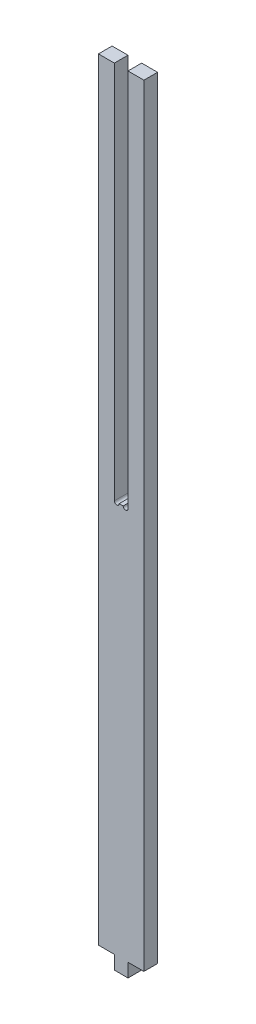
ISO-10303-21;
HEADER;
FILE_DESCRIPTION(('STEP AP214'),'2;1');
FILE_NAME('part.step','',(''),(''),'','','');
FILE_SCHEMA(('AUTOMOTIVE_DESIGN { 1 0 10303 214 1 1 1 1 }'));
ENDSEC;
DATA;
#1=APPLICATION_CONTEXT('core data for automotive mechanical design processes');
#2=APPLICATION_PROTOCOL_DEFINITION('international standard','automotive_design',2000,#1);
#3=PRODUCT_CONTEXT('',#1,'mechanical');
#4=PRODUCT('Part','Part','',(#3));
#5=PRODUCT_RELATED_PRODUCT_CATEGORY('part','',(#4));
#6=PRODUCT_DEFINITION_FORMATION('','',#4);
#7=PRODUCT_DEFINITION_CONTEXT('part definition',#1,'design');
#8=PRODUCT_DEFINITION('design','',#6,#7);
#9=PRODUCT_DEFINITION_SHAPE('','',#8);
#10=(LENGTH_UNIT() NAMED_UNIT(*) SI_UNIT(.MILLI.,.METRE.));
#11=(NAMED_UNIT(*) PLANE_ANGLE_UNIT() SI_UNIT($,.RADIAN.));
#12=(NAMED_UNIT(*) SI_UNIT($,.STERADIAN.) SOLID_ANGLE_UNIT());
#13=UNCERTAINTY_MEASURE_WITH_UNIT(LENGTH_MEASURE(1.E-05),#10,'distance_accuracy_value','');
#14=(GEOMETRIC_REPRESENTATION_CONTEXT(3) GLOBAL_UNCERTAINTY_ASSIGNED_CONTEXT((#13)) GLOBAL_UNIT_ASSIGNED_CONTEXT((#10,
#11,#12)) REPRESENTATION_CONTEXT('',''));
#15=CARTESIAN_POINT('',(0.,0.,0.));
#16=DIRECTION('',(0.,0.,1.));
#17=DIRECTION('',(1.,0.,0.));
#18=AXIS2_PLACEMENT_3D('',#15,#16,#17);
#19=CARTESIAN_POINT('',(-33.2222222222223,843.,18.));
#20=DIRECTION('',(0.,1.,0.));
#21=DIRECTION('',(0.,0.,1.));
#22=AXIS2_PLACEMENT_3D('',#19,#20,#21);
#23=PLANE('',#22);
#24=DIRECTION('',(1.,0.,0.));
#25=VECTOR('',#24,1.);
#26=CARTESIAN_POINT('',(-33.2222222222223,843.,0.));
#27=LINE('',#26,#25);
#28=CARTESIAN_POINT('',(-33.2222222222223,843.,0.));
#29=VERTEX_POINT('',#28);
#30=CARTESIAN_POINT('',(-12.2222222222223,843.,0.));
#31=VERTEX_POINT('',#30);
#32=EDGE_CURVE('E166',#29,#31,#27,.T.);
#33=ORIENTED_EDGE('',*,*,#32,.F.);
#34=DIRECTION('',(0.,0.,-1.));
#35=VECTOR('',#34,1.);
#36=CARTESIAN_POINT('',(-33.2222222222223,843.,18.));
#37=LINE('',#36,#35);
#38=CARTESIAN_POINT('',(-33.2222222222223,843.,18.));
#39=VERTEX_POINT('',#38);
#40=EDGE_CURVE('E11',#39,#29,#37,.T.);
#41=ORIENTED_EDGE('',*,*,#40,.F.);
#42=DIRECTION('',(1.,0.,0.));
#43=VECTOR('',#42,1.);
#44=CARTESIAN_POINT('',(-33.2222222222223,843.,18.));
#45=LINE('',#44,#43);
#46=CARTESIAN_POINT('',(-12.2222222222223,843.,18.));
#47=VERTEX_POINT('',#46);
#48=EDGE_CURVE('E201',#39,#47,#45,.T.);
#49=ORIENTED_EDGE('',*,*,#48,.T.);
#50=DIRECTION('',(0.,0.,-1.));
#51=VECTOR('',#50,1.);
#52=CARTESIAN_POINT('',(-12.2222222222223,843.,18.));
#53=LINE('',#52,#51);
#54=EDGE_CURVE('E36',#47,#31,#53,.T.);
#55=ORIENTED_EDGE('',*,*,#54,.T.);
#56=EDGE_LOOP('',(#33,#41,#49,#55));
#57=FACE_BOUND('',#56,.T.);
#58=ADVANCED_FACE('F33',(#57),#23,.T.);
#59=CARTESIAN_POINT('',(-33.2222222222223,343.,18.));
#60=DIRECTION('',(-1.,0.,0.));
#61=DIRECTION('',(0.,0.,1.));
#62=AXIS2_PLACEMENT_3D('',#59,#60,#61);
#63=PLANE('',#62);
#64=DIRECTION('',(0.,1.,0.));
#65=VECTOR('',#64,1.);
#66=CARTESIAN_POINT('',(-33.2222222222223,343.,0.));
#67=LINE('',#66,#65);
#68=CARTESIAN_POINT('',(-33.2222222222223,343.,0.));
#69=VERTEX_POINT('',#68);
#70=EDGE_CURVE('E199',#69,#29,#67,.T.);
#71=ORIENTED_EDGE('',*,*,#70,.F.);
#72=DIRECTION('',(0.,0.,-1.));
#73=VECTOR('',#72,1.);
#74=CARTESIAN_POINT('',(-33.2222222222223,343.,18.));
#75=LINE('',#74,#73);
#76=CARTESIAN_POINT('',(-33.2222222222223,343.,18.));
#77=VERTEX_POINT('',#76);
#78=EDGE_CURVE('E42',#77,#69,#75,.T.);
#79=ORIENTED_EDGE('',*,*,#78,.F.);
#80=DIRECTION('',(0.,1.,0.));
#81=VECTOR('',#80,1.);
#82=CARTESIAN_POINT('',(-33.2222222222223,343.,18.));
#83=LINE('',#82,#81);
#84=EDGE_CURVE('E148',#77,#39,#83,.T.);
#85=ORIENTED_EDGE('',*,*,#84,.T.);
#86=ORIENTED_EDGE('',*,*,#40,.T.);
#87=EDGE_LOOP('',(#71,#79,#85,#86));
#88=FACE_BOUND('',#87,.T.);
#89=ADVANCED_FACE('F229',(#88),#63,.T.);
#90=CARTESIAN_POINT('',(-36.3972222222223,343.,18.));
#91=DIRECTION('',(0.,0.,-1.));
#92=DIRECTION('',(-1.,0.,0.));
#93=AXIS2_PLACEMENT_3D('',#90,#91,#92);
#94=CYLINDRICAL_SURFACE('',#93,3.175);
#95=CARTESIAN_POINT('',(-36.3972222222223,343.,0.));
#96=DIRECTION('',(0.,0.,-1.));
#97=DIRECTION('',(-1.,0.,0.));
#98=AXIS2_PLACEMENT_3D('',#95,#96,#97);
#99=CIRCLE('',#98,3.175);
#100=CARTESIAN_POINT('',(-39.5722222222223,343.,0.));
#101=VERTEX_POINT('',#100);
#102=EDGE_CURVE('E152',#69,#101,#99,.T.);
#103=ORIENTED_EDGE('',*,*,#102,.T.);
#104=DIRECTION('',(0.,0.,-1.));
#105=VECTOR('',#104,1.);
#106=CARTESIAN_POINT('',(-39.5722222222223,343.,18.));
#107=LINE('',#106,#105);
#108=CARTESIAN_POINT('',(-39.5722222222223,343.,18.));
#109=VERTEX_POINT('',#108);
#110=EDGE_CURVE('E150',#109,#101,#107,.T.);
#111=ORIENTED_EDGE('',*,*,#110,.F.);
#112=CARTESIAN_POINT('',(-36.3972222222223,343.,18.));
#113=DIRECTION('',(0.,0.,-1.));
#114=DIRECTION('',(-1.,0.,0.));
#115=AXIS2_PLACEMENT_3D('',#112,#113,#114);
#116=CIRCLE('',#115,3.175);
#117=EDGE_CURVE('E141',#77,#109,#116,.T.);
#118=ORIENTED_EDGE('',*,*,#117,.F.);
#119=ORIENTED_EDGE('',*,*,#78,.T.);
#120=EDGE_LOOP('',(#103,#111,#118,#119));
#121=FACE_BOUND('',#120,.T.);
#122=ADVANCED_FACE('F151',(#121),#94,.F.);
#123=CARTESIAN_POINT('',(-44.8722222222223,343.,18.));
#124=DIRECTION('',(0.,1.,0.));
#125=DIRECTION('',(0.,0.,1.));
#126=AXIS2_PLACEMENT_3D('',#123,#124,#125);
#127=PLANE('',#126);
#128=DIRECTION('',(1.,0.,0.));
#129=VECTOR('',#128,1.);
#130=CARTESIAN_POINT('',(-44.8722222222223,343.,0.));
#131=LINE('',#130,#129);
#132=CARTESIAN_POINT('',(-44.8722222222223,343.,0.));
#133=VERTEX_POINT('',#132);
#134=EDGE_CURVE('E196',#133,#101,#131,.T.);
#135=ORIENTED_EDGE('',*,*,#134,.F.);
#136=DIRECTION('',(0.,0.,-1.));
#137=VECTOR('',#136,1.);
#138=CARTESIAN_POINT('',(-44.8722222222223,343.,18.));
#139=LINE('',#138,#137);
#140=CARTESIAN_POINT('',(-44.8722222222223,343.,18.));
#141=VERTEX_POINT('',#140);
#142=EDGE_CURVE('E156',#141,#133,#139,.T.);
#143=ORIENTED_EDGE('',*,*,#142,.F.);
#144=DIRECTION('',(1.,0.,0.));
#145=VECTOR('',#144,1.);
#146=CARTESIAN_POINT('',(-44.8722222222223,343.,18.));
#147=LINE('',#146,#145);
#148=EDGE_CURVE('E146',#141,#109,#147,.T.);
#149=ORIENTED_EDGE('',*,*,#148,.T.);
#150=ORIENTED_EDGE('',*,*,#110,.T.);
#151=EDGE_LOOP('',(#135,#143,#149,#150));
#152=FACE_BOUND('',#151,.T.);
#153=ADVANCED_FACE('F158',(#152),#127,.T.);
#154=CARTESIAN_POINT('',(-48.0472222222223,343.,18.));
#155=DIRECTION('',(0.,0.,-1.));
#156=DIRECTION('',(-1.,0.,0.));
#157=AXIS2_PLACEMENT_3D('',#154,#155,#156);
#158=CYLINDRICAL_SURFACE('',#157,3.175);
#159=CARTESIAN_POINT('',(-48.0472222222223,343.,0.));
#160=DIRECTION('',(0.,0.,1.));
#161=DIRECTION('',(1.,0.,0.));
#162=AXIS2_PLACEMENT_3D('',#159,#160,#161);
#163=CIRCLE('',#162,3.175);
#164=CARTESIAN_POINT('',(-51.2222222222223,343.,0.));
#165=VERTEX_POINT('',#164);
#166=EDGE_CURVE('E193',#165,#133,#163,.T.);
#167=ORIENTED_EDGE('',*,*,#166,.F.);
#168=DIRECTION('',(0.,0.,-1.));
#169=VECTOR('',#168,1.);
#170=CARTESIAN_POINT('',(-51.2222222222223,343.,18.));
#171=LINE('',#170,#169);
#172=CARTESIAN_POINT('',(-51.2222222222223,343.,18.));
#173=VERTEX_POINT('',#172);
#174=EDGE_CURVE('E205',#173,#165,#171,.T.);
#175=ORIENTED_EDGE('',*,*,#174,.F.);
#176=CARTESIAN_POINT('',(-48.0472222222223,343.,18.));
#177=DIRECTION('',(0.,0.,1.));
#178=DIRECTION('',(1.,0.,0.));
#179=AXIS2_PLACEMENT_3D('',#176,#177,#178);
#180=CIRCLE('',#179,3.175);
#181=EDGE_CURVE('E159',#173,#141,#180,.T.);
#182=ORIENTED_EDGE('',*,*,#181,.T.);
#183=ORIENTED_EDGE('',*,*,#142,.T.);
#184=EDGE_LOOP('',(#167,#175,#182,#183));
#185=FACE_BOUND('',#184,.T.);
#186=ADVANCED_FACE('F242',(#185),#158,.F.);
#187=CARTESIAN_POINT('',(-51.2222222222223,843.,18.));
#188=DIRECTION('',(1.,0.,0.));
#189=DIRECTION('',(0.,1.,0.));
#190=AXIS2_PLACEMENT_3D('',#187,#188,#189);
#191=PLANE('',#190);
#192=DIRECTION('',(0.,-1.,0.));
#193=VECTOR('',#192,1.);
#194=CARTESIAN_POINT('',(-51.2222222222223,843.,0.));
#195=LINE('',#194,#193);
#196=CARTESIAN_POINT('',(-51.2222222222223,843.,0.));
#197=VERTEX_POINT('',#196);
#198=EDGE_CURVE('E190',#197,#165,#195,.T.);
#199=ORIENTED_EDGE('',*,*,#198,.F.);
#200=DIRECTION('',(0.,0.,-1.));
#201=VECTOR('',#200,1.);
#202=CARTESIAN_POINT('',(-51.2222222222223,843.,18.));
#203=LINE('',#202,#201);
#204=CARTESIAN_POINT('',(-51.2222222222223,843.,18.));
#205=VERTEX_POINT('',#204);
#206=EDGE_CURVE('E207',#205,#197,#203,.T.);
#207=ORIENTED_EDGE('',*,*,#206,.F.);
#208=DIRECTION('',(0.,-1.,0.));
#209=VECTOR('',#208,1.);
#210=CARTESIAN_POINT('',(-51.2222222222223,843.,18.));
#211=LINE('',#210,#209);
#212=EDGE_CURVE('E161',#205,#173,#211,.T.);
#213=ORIENTED_EDGE('',*,*,#212,.T.);
#214=ORIENTED_EDGE('',*,*,#174,.T.);
#215=EDGE_LOOP('',(#199,#207,#213,#214));
#216=FACE_BOUND('',#215,.T.);
#217=ADVANCED_FACE('F245',(#216),#191,.T.);
#218=CARTESIAN_POINT('',(-72.2222222222223,843.,18.));
#219=DIRECTION('',(0.,1.,0.));
#220=DIRECTION('',(0.,0.,1.));
#221=AXIS2_PLACEMENT_3D('',#218,#219,#220);
#222=PLANE('',#221);
#223=DIRECTION('',(1.,0.,0.));
#224=VECTOR('',#223,1.);
#225=CARTESIAN_POINT('',(-72.2222222222223,843.,0.));
#226=LINE('',#225,#224);
#227=CARTESIAN_POINT('',(-72.2222222222223,843.,0.));
#228=VERTEX_POINT('',#227);
#229=EDGE_CURVE('E187',#228,#197,#226,.T.);
#230=ORIENTED_EDGE('',*,*,#229,.F.);
#231=DIRECTION('',(0.,0.,-1.));
#232=VECTOR('',#231,1.);
#233=CARTESIAN_POINT('',(-72.2222222222223,843.,18.));
#234=LINE('',#233,#232);
#235=CARTESIAN_POINT('',(-72.2222222222223,843.,18.));
#236=VERTEX_POINT('',#235);
#237=EDGE_CURVE('E209',#236,#228,#234,.T.);
#238=ORIENTED_EDGE('',*,*,#237,.F.);
#239=DIRECTION('',(1.,0.,0.));
#240=VECTOR('',#239,1.);
#241=CARTESIAN_POINT('',(-72.2222222222223,843.,18.));
#242=LINE('',#241,#240);
#243=EDGE_CURVE('E398',#236,#205,#242,.T.);
#244=ORIENTED_EDGE('',*,*,#243,.T.);
#245=ORIENTED_EDGE('',*,*,#206,.T.);
#246=EDGE_LOOP('',(#230,#238,#244,#245));
#247=FACE_BOUND('',#246,.T.);
#248=ADVANCED_FACE('F249',(#247),#222,.T.);
#249=CARTESIAN_POINT('',(-72.2222222222223,843.,18.));
#250=DIRECTION('',(1.,0.,0.));
#251=DIRECTION('',(0.,1.,0.));
#252=AXIS2_PLACEMENT_3D('',#249,#250,#251);
#253=PLANE('',#252);
#254=DIRECTION('',(0.,-1.,0.));
#255=VECTOR('',#254,1.);
#256=CARTESIAN_POINT('',(-72.2222222222223,843.,0.));
#257=LINE('',#256,#255);
#258=CARTESIAN_POINT('',(-72.2222222222222,-175.,0.));
#259=VERTEX_POINT('',#258);
#260=EDGE_CURVE('E185',#228,#259,#257,.T.);
#261=ORIENTED_EDGE('',*,*,#260,.T.);
#262=DIRECTION('',(0.,0.,-1.));
#263=VECTOR('',#262,1.);
#264=CARTESIAN_POINT('',(-72.2222222222222,-175.,18.));
#265=LINE('',#264,#263);
#266=CARTESIAN_POINT('',(-72.2222222222222,-175.,18.));
#267=VERTEX_POINT('',#266);
#268=EDGE_CURVE('E211',#267,#259,#265,.T.);
#269=ORIENTED_EDGE('',*,*,#268,.F.);
#270=DIRECTION('',(0.,-1.,0.));
#271=VECTOR('',#270,1.);
#272=CARTESIAN_POINT('',(-72.2222222222223,843.,18.));
#273=LINE('',#272,#271);
#274=EDGE_CURVE('E393',#236,#267,#273,.T.);
#275=ORIENTED_EDGE('',*,*,#274,.F.);
#276=ORIENTED_EDGE('',*,*,#237,.T.);
#277=EDGE_LOOP('',(#261,#269,#275,#276));
#278=FACE_BOUND('',#277,.T.);
#279=ADVANCED_FACE('F253',(#278),#253,.F.);
#280=CARTESIAN_POINT('',(-72.2222222222222,-175.,18.));
#281=DIRECTION('',(0.,1.,0.));
#282=DIRECTION('',(0.,0.,1.));
#283=AXIS2_PLACEMENT_3D('',#280,#281,#282);
#284=PLANE('',#283);
#285=DIRECTION('',(1.,0.,0.));
#286=VECTOR('',#285,1.);
#287=CARTESIAN_POINT('',(-72.2222222222222,-175.,0.));
#288=LINE('',#287,#286);
#289=CARTESIAN_POINT('',(-51.2222222222223,-175.,0.));
#290=VERTEX_POINT('',#289);
#291=EDGE_CURVE('E183',#259,#290,#288,.T.);
#292=ORIENTED_EDGE('',*,*,#291,.T.);
#293=DIRECTION('',(0.,0.,-1.));
#294=VECTOR('',#293,1.);
#295=CARTESIAN_POINT('',(-51.2222222222223,-175.,18.));
#296=LINE('',#295,#294);
#297=CARTESIAN_POINT('',(-51.2222222222223,-175.,18.));
#298=VERTEX_POINT('',#297);
#299=EDGE_CURVE('E214',#298,#290,#296,.T.);
#300=ORIENTED_EDGE('',*,*,#299,.F.);
#301=DIRECTION('',(1.,0.,0.));
#302=VECTOR('',#301,1.);
#303=CARTESIAN_POINT('',(-72.2222222222222,-175.,18.));
#304=LINE('',#303,#302);
#305=EDGE_CURVE('E390',#267,#298,#304,.T.);
#306=ORIENTED_EDGE('',*,*,#305,.F.);
#307=ORIENTED_EDGE('',*,*,#268,.T.);
#308=EDGE_LOOP('',(#292,#300,#306,#307));
#309=FACE_BOUND('',#308,.T.);
#310=ADVANCED_FACE('F257',(#309),#284,.F.);
#311=CARTESIAN_POINT('',(-51.2222222222223,-175.,18.));
#312=DIRECTION('',(1.,0.,0.));
#313=DIRECTION('',(0.,0.,-1.));
#314=AXIS2_PLACEMENT_3D('',#311,#312,#313);
#315=PLANE('',#314);
#316=DIRECTION('',(0.,-1.,0.));
#317=VECTOR('',#316,1.);
#318=CARTESIAN_POINT('',(-51.2222222222223,-175.,0.));
#319=LINE('',#318,#317);
#320=CARTESIAN_POINT('',(-51.2222222222223,-193.,0.));
#321=VERTEX_POINT('',#320);
#322=EDGE_CURVE('E181',#290,#321,#319,.T.);
#323=ORIENTED_EDGE('',*,*,#322,.T.);
#324=DIRECTION('',(0.,0.,-1.));
#325=VECTOR('',#324,1.);
#326=CARTESIAN_POINT('',(-51.2222222222223,-193.,18.));
#327=LINE('',#326,#325);
#328=CARTESIAN_POINT('',(-51.2222222222223,-193.,18.));
#329=VERTEX_POINT('',#328);
#330=EDGE_CURVE('E217',#329,#321,#327,.T.);
#331=ORIENTED_EDGE('',*,*,#330,.F.);
#332=DIRECTION('',(0.,-1.,0.));
#333=VECTOR('',#332,1.);
#334=CARTESIAN_POINT('',(-51.2222222222223,-175.,18.));
#335=LINE('',#334,#333);
#336=EDGE_CURVE('E388',#298,#329,#335,.T.);
#337=ORIENTED_EDGE('',*,*,#336,.F.);
#338=ORIENTED_EDGE('',*,*,#299,.T.);
#339=EDGE_LOOP('',(#323,#331,#337,#338));
#340=FACE_BOUND('',#339,.T.);
#341=ADVANCED_FACE('F261',(#340),#315,.F.);
#342=CARTESIAN_POINT('',(-51.2222222222223,-193.,18.));
#343=DIRECTION('',(0.,1.,0.));
#344=DIRECTION('',(0.,0.,1.));
#345=AXIS2_PLACEMENT_3D('',#342,#343,#344);
#346=PLANE('',#345);
#347=DIRECTION('',(1.,0.,0.));
#348=VECTOR('',#347,1.);
#349=CARTESIAN_POINT('',(-51.2222222222223,-193.,0.));
#350=LINE('',#349,#348);
#351=CARTESIAN_POINT('',(-33.2222222222224,-193.,0.));
#352=VERTEX_POINT('',#351);
#353=EDGE_CURVE('E178',#321,#352,#350,.T.);
#354=ORIENTED_EDGE('',*,*,#353,.T.);
#355=DIRECTION('',(0.,0.,-1.));
#356=VECTOR('',#355,1.);
#357=CARTESIAN_POINT('',(-33.2222222222224,-193.,18.));
#358=LINE('',#357,#356);
#359=CARTESIAN_POINT('',(-33.2222222222224,-193.,18.));
#360=VERTEX_POINT('',#359);
#361=EDGE_CURVE('E220',#360,#352,#358,.T.);
#362=ORIENTED_EDGE('',*,*,#361,.F.);
#363=DIRECTION('',(1.,0.,0.));
#364=VECTOR('',#363,1.);
#365=CARTESIAN_POINT('',(-51.2222222222223,-193.,18.));
#366=LINE('',#365,#364);
#367=EDGE_CURVE('E407',#329,#360,#366,.T.);
#368=ORIENTED_EDGE('',*,*,#367,.F.);
#369=ORIENTED_EDGE('',*,*,#330,.T.);
#370=EDGE_LOOP('',(#354,#362,#368,#369));
#371=FACE_BOUND('',#370,.T.);
#372=ADVANCED_FACE('F265',(#371),#346,.F.);
#373=CARTESIAN_POINT('',(-33.2222222222224,-175.,18.));
#374=DIRECTION('',(1.,0.,0.));
#375=DIRECTION('',(0.,1.,0.));
#376=AXIS2_PLACEMENT_3D('',#373,#374,#375);
#377=PLANE('',#376);
#378=DIRECTION('',(0.,-1.,0.));
#379=VECTOR('',#378,1.);
#380=CARTESIAN_POINT('',(-33.2222222222224,-175.,0.));
#381=LINE('',#380,#379);
#382=CARTESIAN_POINT('',(-33.2222222222224,-175.,0.));
#383=VERTEX_POINT('',#382);
#384=EDGE_CURVE('E175',#383,#352,#381,.T.);
#385=ORIENTED_EDGE('',*,*,#384,.F.);
#386=DIRECTION('',(0.,0.,-1.));
#387=VECTOR('',#386,1.);
#388=CARTESIAN_POINT('',(-33.2222222222224,-175.,18.));
#389=LINE('',#388,#387);
#390=CARTESIAN_POINT('',(-33.2222222222224,-175.,18.));
#391=VERTEX_POINT('',#390);
#392=EDGE_CURVE('E222',#391,#383,#389,.T.);
#393=ORIENTED_EDGE('',*,*,#392,.F.);
#394=DIRECTION('',(0.,-1.,0.));
#395=VECTOR('',#394,1.);
#396=CARTESIAN_POINT('',(-33.2222222222224,-175.,18.));
#397=LINE('',#396,#395);
#398=EDGE_CURVE('E380',#391,#360,#397,.T.);
#399=ORIENTED_EDGE('',*,*,#398,.T.);
#400=ORIENTED_EDGE('',*,*,#361,.T.);
#401=EDGE_LOOP('',(#385,#393,#399,#400));
#402=FACE_BOUND('',#401,.T.);
#403=ADVANCED_FACE('F269',(#402),#377,.T.);
#404=CARTESIAN_POINT('',(-33.2222222222224,-175.,18.));
#405=DIRECTION('',(0.,1.,0.));
#406=DIRECTION('',(0.,0.,1.));
#407=AXIS2_PLACEMENT_3D('',#404,#405,#406);
#408=PLANE('',#407);
#409=DIRECTION('',(1.,0.,0.));
#410=VECTOR('',#409,1.);
#411=CARTESIAN_POINT('',(-33.2222222222224,-175.,0.));
#412=LINE('',#411,#410);
#413=CARTESIAN_POINT('',(-12.2222222222222,-175.,0.));
#414=VERTEX_POINT('',#413);
#415=EDGE_CURVE('E172',#383,#414,#412,.T.);
#416=ORIENTED_EDGE('',*,*,#415,.T.);
#417=DIRECTION('',(0.,0.,-1.));
#418=VECTOR('',#417,1.);
#419=CARTESIAN_POINT('',(-12.2222222222222,-175.,18.));
#420=LINE('',#419,#418);
#421=CARTESIAN_POINT('',(-12.2222222222222,-175.,18.));
#422=VERTEX_POINT('',#421);
#423=EDGE_CURVE('E223',#422,#414,#420,.T.);
#424=ORIENTED_EDGE('',*,*,#423,.F.);
#425=DIRECTION('',(1.,0.,0.));
#426=VECTOR('',#425,1.);
#427=CARTESIAN_POINT('',(-33.2222222222224,-175.,18.));
#428=LINE('',#427,#426);
#429=EDGE_CURVE('E410',#391,#422,#428,.T.);
#430=ORIENTED_EDGE('',*,*,#429,.F.);
#431=ORIENTED_EDGE('',*,*,#392,.T.);
#432=EDGE_LOOP('',(#416,#424,#430,#431));
#433=FACE_BOUND('',#432,.T.);
#434=ADVANCED_FACE('F273',(#433),#408,.F.);
#435=CARTESIAN_POINT('',(-12.2222222222223,843.,18.));
#436=DIRECTION('',(1.,0.,0.));
#437=DIRECTION('',(0.,1.,0.));
#438=AXIS2_PLACEMENT_3D('',#435,#436,#437);
#439=PLANE('',#438);
#440=DIRECTION('',(0.,-1.,0.));
#441=VECTOR('',#440,1.);
#442=CARTESIAN_POINT('',(-12.2222222222223,843.,0.));
#443=LINE('',#442,#441);
#444=EDGE_CURVE('E169',#31,#414,#443,.T.);
#445=ORIENTED_EDGE('',*,*,#444,.F.);
#446=ORIENTED_EDGE('',*,*,#54,.F.);
#447=DIRECTION('',(0.,-1.,0.));
#448=VECTOR('',#447,1.);
#449=CARTESIAN_POINT('',(-12.2222222222223,843.,18.));
#450=LINE('',#449,#448);
#451=EDGE_CURVE('E412',#47,#422,#450,.T.);
#452=ORIENTED_EDGE('',*,*,#451,.T.);
#453=ORIENTED_EDGE('',*,*,#423,.T.);
#454=EDGE_LOOP('',(#445,#446,#452,#453));
#455=FACE_BOUND('',#454,.T.);
#456=ADVANCED_FACE('F225',(#455),#439,.T.);
#457=CARTESIAN_POINT('',(-48.0472222222223,343.,18.));
#458=DIRECTION('',(0.,0.,1.));
#459=DIRECTION('',(1.,0.,0.));
#460=AXIS2_PLACEMENT_3D('',#457,#458,#459);
#461=PLANE('',#460);
#462=ORIENTED_EDGE('',*,*,#48,.F.);
#463=ORIENTED_EDGE('',*,*,#84,.F.);
#464=ORIENTED_EDGE('',*,*,#117,.T.);
#465=ORIENTED_EDGE('',*,*,#148,.F.);
#466=ORIENTED_EDGE('',*,*,#181,.F.);
#467=ORIENTED_EDGE('',*,*,#212,.F.);
#468=ORIENTED_EDGE('',*,*,#243,.F.);
#469=ORIENTED_EDGE('',*,*,#274,.T.);
#470=ORIENTED_EDGE('',*,*,#305,.T.);
#471=ORIENTED_EDGE('',*,*,#336,.T.);
#472=ORIENTED_EDGE('',*,*,#367,.T.);
#473=ORIENTED_EDGE('',*,*,#398,.F.);
#474=ORIENTED_EDGE('',*,*,#429,.T.);
#475=ORIENTED_EDGE('',*,*,#451,.F.);
#476=EDGE_LOOP('',(#462,#463,#464,#465,#466,#467,#468,#469,#470,#471,#472,#473,#474,#475));
#477=FACE_BOUND('',#476,.T.);
#478=ADVANCED_FACE('F143',(#477),#461,.T.);
#479=CARTESIAN_POINT('',(-48.0472222222223,343.,0.));
#480=DIRECTION('',(0.,0.,1.));
#481=DIRECTION('',(1.,0.,0.));
#482=AXIS2_PLACEMENT_3D('',#479,#480,#481);
#483=PLANE('',#482);
#484=ORIENTED_EDGE('',*,*,#32,.T.);
#485=ORIENTED_EDGE('',*,*,#444,.T.);
#486=ORIENTED_EDGE('',*,*,#415,.F.);
#487=ORIENTED_EDGE('',*,*,#384,.T.);
#488=ORIENTED_EDGE('',*,*,#353,.F.);
#489=ORIENTED_EDGE('',*,*,#322,.F.);
#490=ORIENTED_EDGE('',*,*,#291,.F.);
#491=ORIENTED_EDGE('',*,*,#260,.F.);
#492=ORIENTED_EDGE('',*,*,#229,.T.);
#493=ORIENTED_EDGE('',*,*,#198,.T.);
#494=ORIENTED_EDGE('',*,*,#166,.T.);
#495=ORIENTED_EDGE('',*,*,#134,.T.);
#496=ORIENTED_EDGE('',*,*,#102,.F.);
#497=ORIENTED_EDGE('',*,*,#70,.T.);
#498=EDGE_LOOP('',(#484,#485,#486,#487,#488,#489,#490,#491,#492,#493,#494,#495,#496,#497));
#499=FACE_BOUND('',#498,.T.);
#500=ADVANCED_FACE('F228',(#499),#483,.F.);
#501=CLOSED_SHELL('',(#58,#89,#122,#153,#186,#217,#248,#279,#310,#341,#372,#403,#434,#456,#478,#500));
#502=MANIFOLD_SOLID_BREP('B2',#501);
#503=ADVANCED_BREP_SHAPE_REPRESENTATION('',(#18,#502),#14);
#504=SHAPE_DEFINITION_REPRESENTATION(#9,#503);
ENDSEC;
END-ISO-10303-21;
